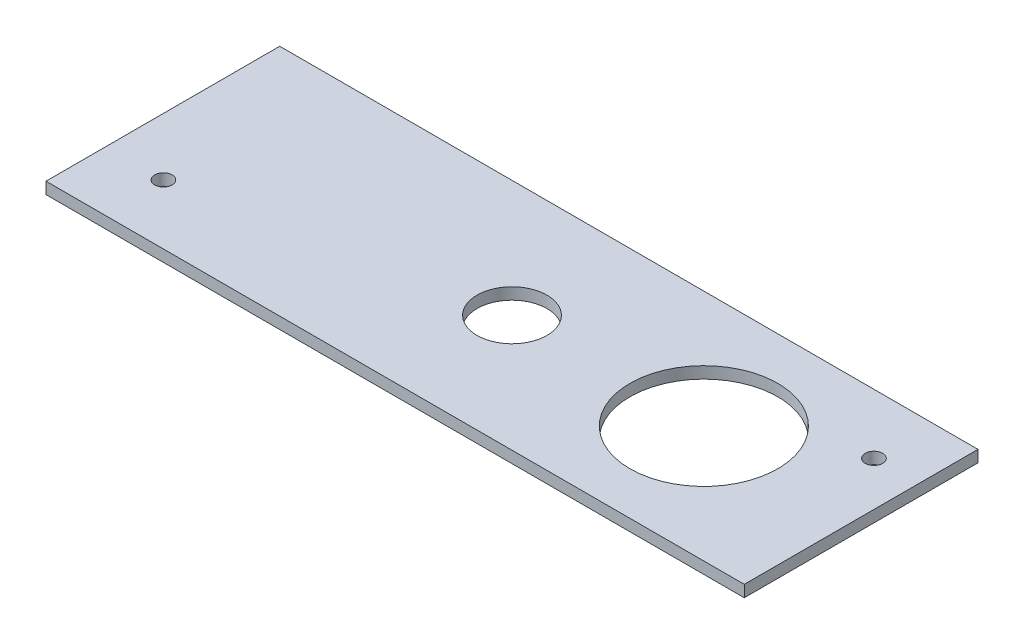
ISO-10303-21;
HEADER;
FILE_DESCRIPTION(('STEP AP214'),'2;1');
FILE_NAME('part.step','',(''),(''),'','','');
FILE_SCHEMA(('AUTOMOTIVE_DESIGN { 1 0 10303 214 1 1 1 1 }'));
ENDSEC;
DATA;
#1=APPLICATION_CONTEXT('core data for automotive mechanical design processes');
#2=APPLICATION_PROTOCOL_DEFINITION('international standard','automotive_design',2000,#1);
#3=PRODUCT_CONTEXT('',#1,'mechanical');
#4=PRODUCT('Part','Part','',(#3));
#5=PRODUCT_RELATED_PRODUCT_CATEGORY('part','',(#4));
#6=PRODUCT_DEFINITION_FORMATION('','',#4);
#7=PRODUCT_DEFINITION_CONTEXT('part definition',#1,'design');
#8=PRODUCT_DEFINITION('design','',#6,#7);
#9=PRODUCT_DEFINITION_SHAPE('','',#8);
#10=(LENGTH_UNIT() NAMED_UNIT(*) SI_UNIT(.MILLI.,.METRE.));
#11=(NAMED_UNIT(*) PLANE_ANGLE_UNIT() SI_UNIT($,.RADIAN.));
#12=(NAMED_UNIT(*) SI_UNIT($,.STERADIAN.) SOLID_ANGLE_UNIT());
#13=UNCERTAINTY_MEASURE_WITH_UNIT(LENGTH_MEASURE(1.E-05),#10,'distance_accuracy_value','');
#14=(GEOMETRIC_REPRESENTATION_CONTEXT(3) GLOBAL_UNCERTAINTY_ASSIGNED_CONTEXT((#13)) GLOBAL_UNIT_ASSIGNED_CONTEXT((#10,
#11,#12)) REPRESENTATION_CONTEXT('',''));
#15=CARTESIAN_POINT('',(0.,0.,0.));
#16=DIRECTION('',(0.,0.,1.));
#17=DIRECTION('',(1.,0.,0.));
#18=AXIS2_PLACEMENT_3D('',#15,#16,#17);
#19=CARTESIAN_POINT('',(0.,1.,10.033));
#20=DIRECTION('',(0.,0.,1.));
#21=DIRECTION('',(1.,0.,0.));
#22=AXIS2_PLACEMENT_3D('',#19,#20,#21);
#23=PLANE('',#22);
#24=DIRECTION('',(-1.,0.,0.));
#25=VECTOR('',#24,1.);
#26=CARTESIAN_POINT('',(0.,0.,10.033));
#27=LINE('',#26,#25);
#28=CARTESIAN_POINT('',(29.972,0.,10.033));
#29=VERTEX_POINT('',#28);
#30=CARTESIAN_POINT('',(-29.972,0.,10.033));
#31=VERTEX_POINT('',#30);
#32=EDGE_CURVE('E125',#29,#31,#27,.T.);
#33=ORIENTED_EDGE('',*,*,#32,.F.);
#34=DIRECTION('',(0.,-1.,0.));
#35=VECTOR('',#34,1.);
#36=CARTESIAN_POINT('',(29.972,1.,10.033));
#37=LINE('',#36,#35);
#38=CARTESIAN_POINT('',(29.972,1.,10.033));
#39=VERTEX_POINT('',#38);
#40=EDGE_CURVE('E11',#39,#29,#37,.T.);
#41=ORIENTED_EDGE('',*,*,#40,.F.);
#42=DIRECTION('',(-1.,0.,0.));
#43=VECTOR('',#42,1.);
#44=CARTESIAN_POINT('',(0.,1.,10.033));
#45=LINE('',#44,#43);
#46=CARTESIAN_POINT('',(-29.972,1.,10.033));
#47=VERTEX_POINT('',#46);
#48=EDGE_CURVE('E102',#39,#47,#45,.T.);
#49=ORIENTED_EDGE('',*,*,#48,.T.);
#50=DIRECTION('',(0.,-1.,0.));
#51=VECTOR('',#50,1.);
#52=CARTESIAN_POINT('',(-29.972,1.,10.033));
#53=LINE('',#52,#51);
#54=EDGE_CURVE('E63',#47,#31,#53,.T.);
#55=ORIENTED_EDGE('',*,*,#54,.T.);
#56=EDGE_LOOP('',(#33,#41,#49,#55));
#57=FACE_BOUND('',#56,.T.);
#58=ADVANCED_FACE('F45',(#57),#23,.T.);
#59=CARTESIAN_POINT('',(29.972,1.,0.));
#60=DIRECTION('',(-1.,0.,0.));
#61=DIRECTION('',(0.,0.,1.));
#62=AXIS2_PLACEMENT_3D('',#59,#60,#61);
#63=PLANE('',#62);
#64=DIRECTION('',(0.,0.,-1.));
#65=VECTOR('',#64,1.);
#66=CARTESIAN_POINT('',(29.972,0.,0.));
#67=LINE('',#66,#65);
#68=CARTESIAN_POINT('',(29.972,0.,-10.033));
#69=VERTEX_POINT('',#68);
#70=EDGE_CURVE('E108',#29,#69,#67,.T.);
#71=ORIENTED_EDGE('',*,*,#70,.T.);
#72=DIRECTION('',(0.,-1.,0.));
#73=VECTOR('',#72,1.);
#74=CARTESIAN_POINT('',(29.972,1.,-10.033));
#75=LINE('',#74,#73);
#76=CARTESIAN_POINT('',(29.972,1.,-10.033));
#77=VERTEX_POINT('',#76);
#78=EDGE_CURVE('E55',#77,#69,#75,.T.);
#79=ORIENTED_EDGE('',*,*,#78,.F.);
#80=DIRECTION('',(0.,0.,-1.));
#81=VECTOR('',#80,1.);
#82=CARTESIAN_POINT('',(29.972,1.,0.));
#83=LINE('',#82,#81);
#84=EDGE_CURVE('E98',#39,#77,#83,.T.);
#85=ORIENTED_EDGE('',*,*,#84,.F.);
#86=ORIENTED_EDGE('',*,*,#40,.T.);
#87=EDGE_LOOP('',(#71,#79,#85,#86));
#88=FACE_BOUND('',#87,.T.);
#89=ADVANCED_FACE('F106',(#88),#63,.F.);
#90=CARTESIAN_POINT('',(0.,1.,-10.033));
#91=DIRECTION('',(0.,0.,1.));
#92=DIRECTION('',(1.,0.,0.));
#93=AXIS2_PLACEMENT_3D('',#90,#91,#92);
#94=PLANE('',#93);
#95=DIRECTION('',(-1.,0.,0.));
#96=VECTOR('',#95,1.);
#97=CARTESIAN_POINT('',(0.,0.,-10.033));
#98=LINE('',#97,#96);
#99=CARTESIAN_POINT('',(-29.972,0.,-10.033));
#100=VERTEX_POINT('',#99);
#101=EDGE_CURVE('E120',#69,#100,#98,.T.);
#102=ORIENTED_EDGE('',*,*,#101,.T.);
#103=DIRECTION('',(0.,-1.,0.));
#104=VECTOR('',#103,1.);
#105=CARTESIAN_POINT('',(-29.972,1.,-10.033));
#106=LINE('',#105,#104);
#107=CARTESIAN_POINT('',(-29.972,1.,-10.033));
#108=VERTEX_POINT('',#107);
#109=EDGE_CURVE('E77',#108,#100,#106,.T.);
#110=ORIENTED_EDGE('',*,*,#109,.F.);
#111=DIRECTION('',(-1.,0.,0.));
#112=VECTOR('',#111,1.);
#113=CARTESIAN_POINT('',(0.,1.,-10.033));
#114=LINE('',#113,#112);
#115=EDGE_CURVE('E89',#77,#108,#114,.T.);
#116=ORIENTED_EDGE('',*,*,#115,.F.);
#117=ORIENTED_EDGE('',*,*,#78,.T.);
#118=EDGE_LOOP('',(#102,#110,#116,#117));
#119=FACE_BOUND('',#118,.T.);
#120=ADVANCED_FACE('F91',(#119),#94,.F.);
#121=CARTESIAN_POINT('',(0.,1.,0.));
#122=DIRECTION('',(0.,-1.,0.));
#123=DIRECTION('',(0.,0.,-1.));
#124=AXIS2_PLACEMENT_3D('',#121,#122,#123);
#125=CYLINDRICAL_SURFACE('',#124,3.);
#126=CARTESIAN_POINT('',(0.,1.,0.));
#127=DIRECTION('',(0.,1.,0.));
#128=DIRECTION('',(0.,0.,1.));
#129=AXIS2_PLACEMENT_3D('',#126,#127,#128);
#130=CIRCLE('',#129,3.);
#131=CARTESIAN_POINT('',(0.,1.,3.));
#132=VERTEX_POINT('',#131);
#133=EDGE_CURVE('E148',#132,#132,#130,.T.);
#134=ORIENTED_EDGE('',*,*,#133,.T.);
#135=EDGE_LOOP('',(#134));
#136=FACE_BOUND('',#135,.T.);
#137=CARTESIAN_POINT('',(0.,0.,0.));
#138=DIRECTION('',(0.,1.,0.));
#139=DIRECTION('',(0.,0.,1.));
#140=AXIS2_PLACEMENT_3D('',#137,#138,#139);
#141=CIRCLE('',#140,3.);
#142=CARTESIAN_POINT('',(0.,0.,3.));
#143=VERTEX_POINT('',#142);
#144=EDGE_CURVE('E128',#143,#143,#141,.T.);
#145=ORIENTED_EDGE('',*,*,#144,.F.);
#146=EDGE_LOOP('',(#145));
#147=FACE_BOUND('',#146,.T.);
#148=ADVANCED_FACE('F177',(#136,#147),#125,.F.);
#149=CARTESIAN_POINT('',(26.172,1.,-4.9));
#150=DIRECTION('',(0.,-1.,0.));
#151=DIRECTION('',(0.,0.,-1.));
#152=AXIS2_PLACEMENT_3D('',#149,#150,#151);
#153=CYLINDRICAL_SURFACE('',#152,0.750000000000002);
#154=CARTESIAN_POINT('',(26.172,1.,-4.9));
#155=DIRECTION('',(0.,1.,0.));
#156=DIRECTION('',(0.,0.,1.));
#157=AXIS2_PLACEMENT_3D('',#154,#155,#156);
#158=CIRCLE('',#157,0.750000000000002);
#159=CARTESIAN_POINT('',(26.172,1.,-4.15));
#160=VERTEX_POINT('',#159);
#161=EDGE_CURVE('E152',#160,#160,#158,.T.);
#162=ORIENTED_EDGE('',*,*,#161,.T.);
#163=EDGE_LOOP('',(#162));
#164=FACE_BOUND('',#163,.T.);
#165=CARTESIAN_POINT('',(26.172,0.,-4.9));
#166=DIRECTION('',(0.,1.,0.));
#167=DIRECTION('',(0.,0.,1.));
#168=AXIS2_PLACEMENT_3D('',#165,#166,#167);
#169=CIRCLE('',#168,0.750000000000002);
#170=CARTESIAN_POINT('',(26.172,0.,-4.15));
#171=VERTEX_POINT('',#170);
#172=EDGE_CURVE('E132',#171,#171,#169,.T.);
#173=ORIENTED_EDGE('',*,*,#172,.F.);
#174=EDGE_LOOP('',(#173));
#175=FACE_BOUND('',#174,.T.);
#176=ADVANCED_FACE('F180',(#164,#175),#153,.F.);
#177=CARTESIAN_POINT('',(-25.028,1.,4.90000000000001));
#178=DIRECTION('',(0.,-1.,0.));
#179=DIRECTION('',(0.,0.,-1.));
#180=AXIS2_PLACEMENT_3D('',#177,#178,#179);
#181=CYLINDRICAL_SURFACE('',#180,0.750000000000002);
#182=CARTESIAN_POINT('',(-25.028,1.,4.90000000000001));
#183=DIRECTION('',(0.,1.,0.));
#184=DIRECTION('',(0.,0.,1.));
#185=AXIS2_PLACEMENT_3D('',#182,#183,#184);
#186=CIRCLE('',#185,0.750000000000002);
#187=CARTESIAN_POINT('',(-25.028,1.,5.65000000000001));
#188=VERTEX_POINT('',#187);
#189=EDGE_CURVE('E156',#188,#188,#186,.T.);
#190=ORIENTED_EDGE('',*,*,#189,.T.);
#191=EDGE_LOOP('',(#190));
#192=FACE_BOUND('',#191,.T.);
#193=CARTESIAN_POINT('',(-25.028,0.,4.90000000000001));
#194=DIRECTION('',(0.,1.,0.));
#195=DIRECTION('',(0.,0.,1.));
#196=AXIS2_PLACEMENT_3D('',#193,#194,#195);
#197=CIRCLE('',#196,0.750000000000002);
#198=CARTESIAN_POINT('',(-25.028,0.,5.65000000000001));
#199=VERTEX_POINT('',#198);
#200=EDGE_CURVE('E136',#199,#199,#197,.T.);
#201=ORIENTED_EDGE('',*,*,#200,.F.);
#202=EDGE_LOOP('',(#201));
#203=FACE_BOUND('',#202,.T.);
#204=ADVANCED_FACE('F193',(#192,#203),#181,.F.);
#205=CARTESIAN_POINT('',(16.472,1.,0.));
#206=DIRECTION('',(0.,-1.,0.));
#207=DIRECTION('',(0.,0.,-1.));
#208=AXIS2_PLACEMENT_3D('',#205,#206,#207);
#209=CYLINDRICAL_SURFACE('',#208,6.35);
#210=CARTESIAN_POINT('',(16.472,1.,0.));
#211=DIRECTION('',(0.,1.,0.));
#212=DIRECTION('',(0.,0.,1.));
#213=AXIS2_PLACEMENT_3D('',#210,#211,#212);
#214=CIRCLE('',#213,6.35);
#215=CARTESIAN_POINT('',(16.472,1.,6.35));
#216=VERTEX_POINT('',#215);
#217=EDGE_CURVE('E119',#216,#216,#214,.T.);
#218=ORIENTED_EDGE('',*,*,#217,.T.);
#219=EDGE_LOOP('',(#218));
#220=FACE_BOUND('',#219,.T.);
#221=CARTESIAN_POINT('',(16.472,0.,0.));
#222=DIRECTION('',(0.,1.,0.));
#223=DIRECTION('',(0.,0.,1.));
#224=AXIS2_PLACEMENT_3D('',#221,#222,#223);
#225=CIRCLE('',#224,6.35);
#226=CARTESIAN_POINT('',(16.472,0.,6.35));
#227=VERTEX_POINT('',#226);
#228=EDGE_CURVE('E140',#227,#227,#225,.T.);
#229=ORIENTED_EDGE('',*,*,#228,.F.);
#230=EDGE_LOOP('',(#229));
#231=FACE_BOUND('',#230,.T.);
#232=ADVANCED_FACE('F47',(#220,#231),#209,.F.);
#233=CARTESIAN_POINT('',(-29.972,1.,0.));
#234=DIRECTION('',(-1.,0.,0.));
#235=DIRECTION('',(0.,0.,1.));
#236=AXIS2_PLACEMENT_3D('',#233,#234,#235);
#237=PLANE('',#236);
#238=DIRECTION('',(0.,0.,-1.));
#239=VECTOR('',#238,1.);
#240=CARTESIAN_POINT('',(-29.972,0.,0.));
#241=LINE('',#240,#239);
#242=EDGE_CURVE('E115',#31,#100,#241,.T.);
#243=ORIENTED_EDGE('',*,*,#242,.F.);
#244=ORIENTED_EDGE('',*,*,#54,.F.);
#245=DIRECTION('',(0.,0.,-1.));
#246=VECTOR('',#245,1.);
#247=CARTESIAN_POINT('',(-29.972,1.,0.));
#248=LINE('',#247,#246);
#249=EDGE_CURVE('E97',#47,#108,#248,.T.);
#250=ORIENTED_EDGE('',*,*,#249,.T.);
#251=ORIENTED_EDGE('',*,*,#109,.T.);
#252=EDGE_LOOP('',(#243,#244,#250,#251));
#253=FACE_BOUND('',#252,.T.);
#254=ADVANCED_FACE('F169',(#253),#237,.T.);
#255=CARTESIAN_POINT('',(0.,1.,0.));
#256=DIRECTION('',(0.,1.,0.));
#257=DIRECTION('',(0.,0.,1.));
#258=AXIS2_PLACEMENT_3D('',#255,#256,#257);
#259=PLANE('',#258);
#260=ORIENTED_EDGE('',*,*,#217,.F.);
#261=EDGE_LOOP('',(#260));
#262=FACE_BOUND('',#261,.T.);
#263=ORIENTED_EDGE('',*,*,#189,.F.);
#264=EDGE_LOOP('',(#263));
#265=FACE_BOUND('',#264,.T.);
#266=ORIENTED_EDGE('',*,*,#161,.F.);
#267=EDGE_LOOP('',(#266));
#268=FACE_BOUND('',#267,.T.);
#269=ORIENTED_EDGE('',*,*,#133,.F.);
#270=EDGE_LOOP('',(#269));
#271=FACE_BOUND('',#270,.T.);
#272=ORIENTED_EDGE('',*,*,#48,.F.);
#273=ORIENTED_EDGE('',*,*,#84,.T.);
#274=ORIENTED_EDGE('',*,*,#115,.T.);
#275=ORIENTED_EDGE('',*,*,#249,.F.);
#276=EDGE_LOOP('',(#272,#273,#274,#275));
#277=FACE_BOUND('',#276,.T.);
#278=ADVANCED_FACE('F101',(#262,#265,#268,#271,#277),#259,.T.);
#279=CARTESIAN_POINT('',(0.,0.,0.));
#280=DIRECTION('',(0.,1.,0.));
#281=DIRECTION('',(0.,0.,1.));
#282=AXIS2_PLACEMENT_3D('',#279,#280,#281);
#283=PLANE('',#282);
#284=ORIENTED_EDGE('',*,*,#228,.T.);
#285=EDGE_LOOP('',(#284));
#286=FACE_BOUND('',#285,.T.);
#287=ORIENTED_EDGE('',*,*,#200,.T.);
#288=EDGE_LOOP('',(#287));
#289=FACE_BOUND('',#288,.T.);
#290=ORIENTED_EDGE('',*,*,#172,.T.);
#291=EDGE_LOOP('',(#290));
#292=FACE_BOUND('',#291,.T.);
#293=ORIENTED_EDGE('',*,*,#144,.T.);
#294=EDGE_LOOP('',(#293));
#295=FACE_BOUND('',#294,.T.);
#296=ORIENTED_EDGE('',*,*,#32,.T.);
#297=ORIENTED_EDGE('',*,*,#242,.T.);
#298=ORIENTED_EDGE('',*,*,#101,.F.);
#299=ORIENTED_EDGE('',*,*,#70,.F.);
#300=EDGE_LOOP('',(#296,#297,#298,#299));
#301=FACE_BOUND('',#300,.T.);
#302=ADVANCED_FACE('F168',(#286,#289,#292,#295,#301),#283,.F.);
#303=CLOSED_SHELL('',(#58,#89,#120,#148,#176,#204,#232,#254,#278,#302));
#304=MANIFOLD_SOLID_BREP('B2',#303);
#305=ADVANCED_BREP_SHAPE_REPRESENTATION('',(#18,#304),#14);
#306=SHAPE_DEFINITION_REPRESENTATION(#9,#305);
ENDSEC;
END-ISO-10303-21;
